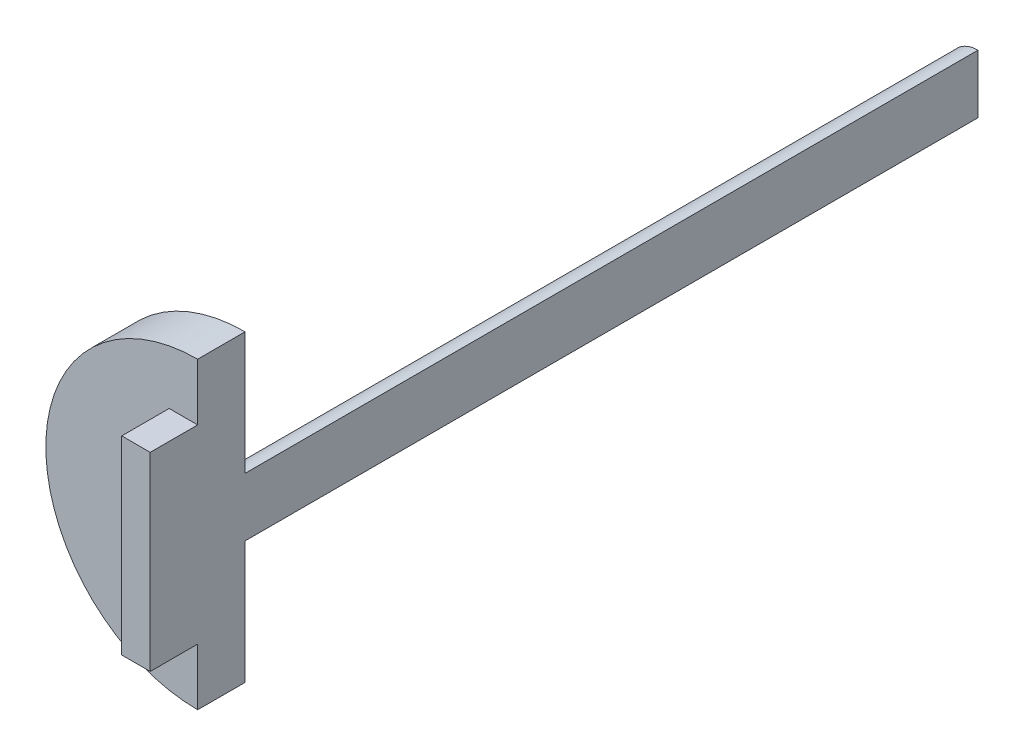
ISO-10303-21;
HEADER;
FILE_DESCRIPTION(('STEP AP214'),'2;1');
FILE_NAME('part.step','',(''),(''),'','','');
FILE_SCHEMA(('AUTOMOTIVE_DESIGN { 1 0 10303 214 1 1 1 1 }'));
ENDSEC;
DATA;
#1=APPLICATION_CONTEXT('core data for automotive mechanical design processes');
#2=APPLICATION_PROTOCOL_DEFINITION('international standard','automotive_design',2000,#1);
#3=PRODUCT_CONTEXT('',#1,'mechanical');
#4=PRODUCT('Part','Part','',(#3));
#5=PRODUCT_RELATED_PRODUCT_CATEGORY('part','',(#4));
#6=PRODUCT_DEFINITION_FORMATION('','',#4);
#7=PRODUCT_DEFINITION_CONTEXT('part definition',#1,'design');
#8=PRODUCT_DEFINITION('design','',#6,#7);
#9=PRODUCT_DEFINITION_SHAPE('','',#8);
#10=(LENGTH_UNIT() NAMED_UNIT(*) SI_UNIT(.MILLI.,.METRE.));
#11=(NAMED_UNIT(*) PLANE_ANGLE_UNIT() SI_UNIT($,.RADIAN.));
#12=(NAMED_UNIT(*) SI_UNIT($,.STERADIAN.) SOLID_ANGLE_UNIT());
#13=UNCERTAINTY_MEASURE_WITH_UNIT(LENGTH_MEASURE(1.E-05),#10,'distance_accuracy_value','');
#14=(GEOMETRIC_REPRESENTATION_CONTEXT(3) GLOBAL_UNCERTAINTY_ASSIGNED_CONTEXT((#13)) GLOBAL_UNIT_ASSIGNED_CONTEXT((#10,
#11,#12)) REPRESENTATION_CONTEXT('',''));
#15=CARTESIAN_POINT('',(0.,0.,0.));
#16=DIRECTION('',(0.,0.,1.));
#17=DIRECTION('',(1.,0.,0.));
#18=AXIS2_PLACEMENT_3D('',#15,#16,#17);
#19=CARTESIAN_POINT('',(0.,0.,77.23));
#20=DIRECTION('',(0.,0.,-1.));
#21=DIRECTION('',(-1.,0.,0.));
#22=AXIS2_PLACEMENT_3D('',#19,#20,#21);
#23=CYLINDRICAL_SURFACE('',#22,3.085);
#24=CARTESIAN_POINT('',(0.,0.,77.23));
#25=DIRECTION('',(0.,0.,1.));
#26=DIRECTION('',(1.,0.,0.));
#27=AXIS2_PLACEMENT_3D('',#24,#25,#26);
#28=CIRCLE('',#27,3.085);
#29=CARTESIAN_POINT('',(0.,3.085,77.23));
#30=VERTEX_POINT('',#29);
#31=CARTESIAN_POINT('',(0.,-3.085,77.23));
#32=VERTEX_POINT('',#31);
#33=EDGE_CURVE('E40',#30,#32,#28,.T.);
#34=ORIENTED_EDGE('',*,*,#33,.F.);
#35=DIRECTION('',(0.,0.,-1.));
#36=VECTOR('',#35,1.);
#37=CARTESIAN_POINT('',(0.,3.085,77.23));
#38=LINE('',#37,#36);
#39=CARTESIAN_POINT('',(0.,3.085,0.));
#40=VERTEX_POINT('',#39);
#41=EDGE_CURVE('E116',#30,#40,#38,.T.);
#42=ORIENTED_EDGE('',*,*,#41,.T.);
#43=CARTESIAN_POINT('',(0.,0.,0.));
#44=DIRECTION('',(0.,0.,1.));
#45=DIRECTION('',(1.,0.,0.));
#46=AXIS2_PLACEMENT_3D('',#43,#44,#45);
#47=CIRCLE('',#46,3.085);
#48=CARTESIAN_POINT('',(0.,-3.085,0.));
#49=VERTEX_POINT('',#48);
#50=EDGE_CURVE('E112',#40,#49,#47,.T.);
#51=ORIENTED_EDGE('',*,*,#50,.T.);
#52=DIRECTION('',(0.,0.,-1.));
#53=VECTOR('',#52,1.);
#54=CARTESIAN_POINT('',(0.,-3.085,77.23));
#55=LINE('',#54,#53);
#56=EDGE_CURVE('E96',#49,#32,#55,.F.);
#57=ORIENTED_EDGE('',*,*,#56,.T.);
#58=EDGE_LOOP('',(#34,#42,#51,#57));
#59=FACE_BOUND('',#58,.T.);
#60=ADVANCED_FACE('F33',(#59),#23,.T.);
#61=CARTESIAN_POINT('',(0.,0.,0.));
#62=DIRECTION('',(0.,0.,1.));
#63=DIRECTION('',(1.,0.,0.));
#64=AXIS2_PLACEMENT_3D('',#61,#62,#63);
#65=PLANE('',#64);
#66=ORIENTED_EDGE('',*,*,#50,.F.);
#67=DIRECTION('',(0.,1.,0.));
#68=VECTOR('',#67,1.);
#69=CARTESIAN_POINT('',(0.,-16.,0.));
#70=LINE('',#69,#68);
#71=EDGE_CURVE('E99',#49,#40,#70,.T.);
#72=ORIENTED_EDGE('',*,*,#71,.F.);
#73=EDGE_LOOP('',(#66,#72));
#74=FACE_BOUND('',#73,.T.);
#75=ADVANCED_FACE('F111',(#74),#65,.F.);
#76=CARTESIAN_POINT('',(0.,0.,82.23));
#77=DIRECTION('',(0.,0.,-1.));
#78=DIRECTION('',(-1.,0.,0.));
#79=AXIS2_PLACEMENT_3D('',#76,#77,#78);
#80=CYLINDRICAL_SURFACE('',#79,16.);
#81=CARTESIAN_POINT('',(0.,0.,82.23));
#82=DIRECTION('',(0.,0.,1.));
#83=DIRECTION('',(1.,0.,0.));
#84=AXIS2_PLACEMENT_3D('',#81,#82,#83);
#85=CIRCLE('',#84,16.);
#86=CARTESIAN_POINT('',(0.,16.,82.23));
#87=VERTEX_POINT('',#86);
#88=CARTESIAN_POINT('',(0.,-16.,82.23));
#89=VERTEX_POINT('',#88);
#90=EDGE_CURVE('E117',#87,#89,#85,.T.);
#91=ORIENTED_EDGE('',*,*,#90,.F.);
#92=DIRECTION('',(0.,0.,1.));
#93=VECTOR('',#92,1.);
#94=CARTESIAN_POINT('',(0.,16.,-35.7770876399966));
#95=LINE('',#94,#93);
#96=CARTESIAN_POINT('',(0.,16.,77.23));
#97=VERTEX_POINT('',#96);
#98=EDGE_CURVE('E114',#97,#87,#95,.T.);
#99=ORIENTED_EDGE('',*,*,#98,.F.);
#100=CARTESIAN_POINT('',(0.,0.,77.23));
#101=DIRECTION('',(0.,0.,1.));
#102=DIRECTION('',(1.,0.,0.));
#103=AXIS2_PLACEMENT_3D('',#100,#101,#102);
#104=CIRCLE('',#103,16.);
#105=CARTESIAN_POINT('',(0.,-16.,77.23));
#106=VERTEX_POINT('',#105);
#107=EDGE_CURVE('E120',#97,#106,#104,.T.);
#108=ORIENTED_EDGE('',*,*,#107,.T.);
#109=DIRECTION('',(0.,0.,1.));
#110=VECTOR('',#109,1.);
#111=CARTESIAN_POINT('',(0.,-16.,-35.7770876399966));
#112=LINE('',#111,#110);
#113=EDGE_CURVE('E151',#106,#89,#112,.T.);
#114=ORIENTED_EDGE('',*,*,#113,.T.);
#115=EDGE_LOOP('',(#91,#99,#108,#114));
#116=FACE_BOUND('',#115,.T.);
#117=ADVANCED_FACE('F162',(#116),#80,.T.);
#118=CARTESIAN_POINT('',(0.,0.,82.23));
#119=DIRECTION('',(0.,0.,1.));
#120=DIRECTION('',(1.,0.,0.));
#121=AXIS2_PLACEMENT_3D('',#118,#119,#120);
#122=PLANE('',#121);
#123=DIRECTION('',(0.,-1.,0.));
#124=VECTOR('',#123,1.);
#125=CARTESIAN_POINT('',(0.,0.,82.23));
#126=LINE('',#125,#124);
#127=CARTESIAN_POINT('',(0.,10.,82.23));
#128=VERTEX_POINT('',#127);
#129=EDGE_CURVE('E145',#87,#128,#126,.T.);
#130=ORIENTED_EDGE('',*,*,#129,.F.);
#131=ORIENTED_EDGE('',*,*,#90,.T.);
#132=CARTESIAN_POINT('',(0.,-10.,82.23));
#133=VERTEX_POINT('',#132);
#134=EDGE_CURVE('E147',#133,#89,#126,.T.);
#135=ORIENTED_EDGE('',*,*,#134,.F.);
#136=DIRECTION('',(1.,0.,0.));
#137=VECTOR('',#136,1.);
#138=CARTESIAN_POINT('',(-3.,-10.,82.23));
#139=LINE('',#138,#137);
#140=CARTESIAN_POINT('',(-3.,-10.,82.23));
#141=VERTEX_POINT('',#140);
#142=EDGE_CURVE('E54',#141,#133,#139,.T.);
#143=ORIENTED_EDGE('',*,*,#142,.F.);
#144=DIRECTION('',(0.,-1.,0.));
#145=VECTOR('',#144,1.);
#146=CARTESIAN_POINT('',(-3.,10.,82.23));
#147=LINE('',#146,#145);
#148=CARTESIAN_POINT('',(-3.,10.,82.23));
#149=VERTEX_POINT('',#148);
#150=EDGE_CURVE('E134',#149,#141,#147,.T.);
#151=ORIENTED_EDGE('',*,*,#150,.F.);
#152=DIRECTION('',(-1.,0.,0.));
#153=VECTOR('',#152,1.);
#154=CARTESIAN_POINT('',(-3.,10.,82.23));
#155=LINE('',#154,#153);
#156=EDGE_CURVE('E136',#128,#149,#155,.T.);
#157=ORIENTED_EDGE('',*,*,#156,.F.);
#158=EDGE_LOOP('',(#130,#131,#135,#143,#151,#157));
#159=FACE_BOUND('',#158,.T.);
#160=ADVANCED_FACE('F161',(#159),#122,.T.);
#161=CARTESIAN_POINT('',(0.,0.,77.23));
#162=DIRECTION('',(0.,0.,1.));
#163=DIRECTION('',(1.,0.,0.));
#164=AXIS2_PLACEMENT_3D('',#161,#162,#163);
#165=PLANE('',#164);
#166=ORIENTED_EDGE('',*,*,#107,.F.);
#167=DIRECTION('',(0.,-1.,0.));
#168=VECTOR('',#167,1.);
#169=CARTESIAN_POINT('',(0.,0.,77.23));
#170=LINE('',#169,#168);
#171=EDGE_CURVE('E107',#97,#30,#170,.T.);
#172=ORIENTED_EDGE('',*,*,#171,.T.);
#173=ORIENTED_EDGE('',*,*,#33,.T.);
#174=EDGE_CURVE('E102',#32,#106,#170,.T.);
#175=ORIENTED_EDGE('',*,*,#174,.T.);
#176=EDGE_LOOP('',(#166,#172,#173,#175));
#177=FACE_BOUND('',#176,.T.);
#178=ADVANCED_FACE('F164',(#177),#165,.F.);
#179=CARTESIAN_POINT('',(-3.,10.,87.23));
#180=DIRECTION('',(0.,-1.,0.));
#181=DIRECTION('',(0.,0.,-1.));
#182=AXIS2_PLACEMENT_3D('',#179,#180,#181);
#183=PLANE('',#182);
#184=DIRECTION('',(-1.,0.,0.));
#185=VECTOR('',#184,1.);
#186=CARTESIAN_POINT('',(-3.,10.,87.23));
#187=LINE('',#186,#185);
#188=CARTESIAN_POINT('',(0.,10.,87.23));
#189=VERTEX_POINT('',#188);
#190=CARTESIAN_POINT('',(-3.,10.,87.23));
#191=VERTEX_POINT('',#190);
#192=EDGE_CURVE('E133',#189,#191,#187,.T.);
#193=ORIENTED_EDGE('',*,*,#192,.F.);
#194=DIRECTION('',(0.,0.,-1.));
#195=VECTOR('',#194,1.);
#196=CARTESIAN_POINT('',(0.,10.,87.23));
#197=LINE('',#196,#195);
#198=EDGE_CURVE('E46',#189,#128,#197,.T.);
#199=ORIENTED_EDGE('',*,*,#198,.T.);
#200=ORIENTED_EDGE('',*,*,#156,.T.);
#201=DIRECTION('',(0.,0.,-1.));
#202=VECTOR('',#201,1.);
#203=CARTESIAN_POINT('',(-3.,10.,87.23));
#204=LINE('',#203,#202);
#205=EDGE_CURVE('E124',#191,#149,#204,.T.);
#206=ORIENTED_EDGE('',*,*,#205,.F.);
#207=EDGE_LOOP('',(#193,#199,#200,#206));
#208=FACE_BOUND('',#207,.T.);
#209=ADVANCED_FACE('F166',(#208),#183,.F.);
#210=CARTESIAN_POINT('',(-3.,10.,87.23));
#211=DIRECTION('',(1.,0.,0.));
#212=DIRECTION('',(0.,1.,0.));
#213=AXIS2_PLACEMENT_3D('',#210,#211,#212);
#214=PLANE('',#213);
#215=ORIENTED_EDGE('',*,*,#150,.T.);
#216=DIRECTION('',(0.,0.,-1.));
#217=VECTOR('',#216,1.);
#218=CARTESIAN_POINT('',(-3.,-10.,87.23));
#219=LINE('',#218,#217);
#220=CARTESIAN_POINT('',(-3.,-10.,87.23));
#221=VERTEX_POINT('',#220);
#222=EDGE_CURVE('E128',#221,#141,#219,.T.);
#223=ORIENTED_EDGE('',*,*,#222,.F.);
#224=DIRECTION('',(0.,-1.,0.));
#225=VECTOR('',#224,1.);
#226=CARTESIAN_POINT('',(-3.,10.,87.23));
#227=LINE('',#226,#225);
#228=EDGE_CURVE('E140',#191,#221,#227,.T.);
#229=ORIENTED_EDGE('',*,*,#228,.F.);
#230=ORIENTED_EDGE('',*,*,#205,.T.);
#231=EDGE_LOOP('',(#215,#223,#229,#230));
#232=FACE_BOUND('',#231,.T.);
#233=ADVANCED_FACE('F172',(#232),#214,.F.);
#234=CARTESIAN_POINT('',(-3.,-10.,87.23));
#235=DIRECTION('',(0.,1.,0.));
#236=DIRECTION('',(0.,0.,1.));
#237=AXIS2_PLACEMENT_3D('',#234,#235,#236);
#238=PLANE('',#237);
#239=ORIENTED_EDGE('',*,*,#142,.T.);
#240=DIRECTION('',(0.,0.,1.));
#241=VECTOR('',#240,1.);
#242=CARTESIAN_POINT('',(0.,-10.,87.23));
#243=LINE('',#242,#241);
#244=CARTESIAN_POINT('',(0.,-10.,87.23));
#245=VERTEX_POINT('',#244);
#246=EDGE_CURVE('E113',#133,#245,#243,.T.);
#247=ORIENTED_EDGE('',*,*,#246,.T.);
#248=DIRECTION('',(1.,0.,0.));
#249=VECTOR('',#248,1.);
#250=CARTESIAN_POINT('',(-3.,-10.,87.23));
#251=LINE('',#250,#249);
#252=EDGE_CURVE('E131',#221,#245,#251,.T.);
#253=ORIENTED_EDGE('',*,*,#252,.F.);
#254=ORIENTED_EDGE('',*,*,#222,.T.);
#255=EDGE_LOOP('',(#239,#247,#253,#254));
#256=FACE_BOUND('',#255,.T.);
#257=ADVANCED_FACE('F207',(#256),#238,.F.);
#258=CARTESIAN_POINT('',(0.,0.,87.23));
#259=DIRECTION('',(0.,0.,1.));
#260=DIRECTION('',(1.,0.,0.));
#261=AXIS2_PLACEMENT_3D('',#258,#259,#260);
#262=PLANE('',#261);
#263=DIRECTION('',(0.,-1.,0.));
#264=VECTOR('',#263,1.);
#265=CARTESIAN_POINT('',(0.,0.,87.23));
#266=LINE('',#265,#264);
#267=EDGE_CURVE('E11',#189,#245,#266,.T.);
#268=ORIENTED_EDGE('',*,*,#267,.F.);
#269=ORIENTED_EDGE('',*,*,#192,.T.);
#270=ORIENTED_EDGE('',*,*,#228,.T.);
#271=ORIENTED_EDGE('',*,*,#252,.T.);
#272=EDGE_LOOP('',(#268,#269,#270,#271));
#273=FACE_BOUND('',#272,.T.);
#274=ADVANCED_FACE('F212',(#273),#262,.T.);
#275=CARTESIAN_POINT('',(0.,-16.,-35.7770876399966));
#276=DIRECTION('',(-1.,0.,0.));
#277=DIRECTION('',(0.,0.,1.));
#278=AXIS2_PLACEMENT_3D('',#275,#276,#277);
#279=PLANE('',#278);
#280=ORIENTED_EDGE('',*,*,#171,.F.);
#281=ORIENTED_EDGE('',*,*,#98,.T.);
#282=ORIENTED_EDGE('',*,*,#129,.T.);
#283=ORIENTED_EDGE('',*,*,#198,.F.);
#284=ORIENTED_EDGE('',*,*,#267,.T.);
#285=ORIENTED_EDGE('',*,*,#246,.F.);
#286=ORIENTED_EDGE('',*,*,#134,.T.);
#287=ORIENTED_EDGE('',*,*,#113,.F.);
#288=ORIENTED_EDGE('',*,*,#174,.F.);
#289=ORIENTED_EDGE('',*,*,#56,.F.);
#290=ORIENTED_EDGE('',*,*,#71,.T.);
#291=ORIENTED_EDGE('',*,*,#41,.F.);
#292=EDGE_LOOP('',(#280,#281,#282,#283,#284,#285,#286,#287,#288,#289,#290,#291));
#293=FACE_BOUND('',#292,.T.);
#294=ADVANCED_FACE('F98',(#293),#279,.F.);
#295=CLOSED_SHELL('',(#60,#75,#117,#160,#178,#209,#233,#257,#274,#294));
#296=MANIFOLD_SOLID_BREP('B2',#295);
#297=ADVANCED_BREP_SHAPE_REPRESENTATION('',(#18,#296),#14);
#298=SHAPE_DEFINITION_REPRESENTATION(#9,#297);
ENDSEC;
END-ISO-10303-21;
